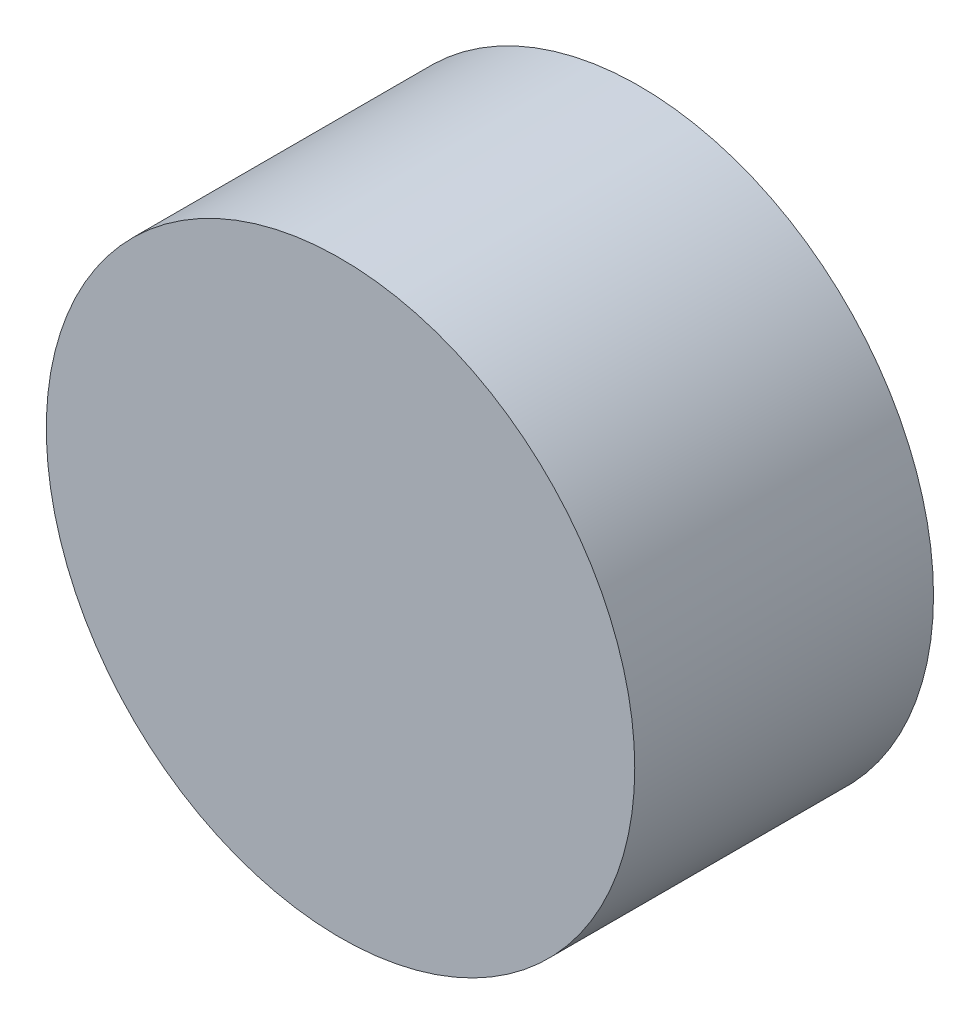
ISO-10303-21;
HEADER;
FILE_DESCRIPTION(('STEP AP214'),'2;1');
FILE_NAME('part.step','',(''),(''),'','','');
FILE_SCHEMA(('AUTOMOTIVE_DESIGN { 1 0 10303 214 1 1 1 1 }'));
ENDSEC;
DATA;
#1=APPLICATION_CONTEXT('core data for automotive mechanical design processes');
#2=APPLICATION_PROTOCOL_DEFINITION('international standard','automotive_design',2000,#1);
#3=PRODUCT_CONTEXT('',#1,'mechanical');
#4=PRODUCT('Part','Part','',(#3));
#5=PRODUCT_RELATED_PRODUCT_CATEGORY('part','',(#4));
#6=PRODUCT_DEFINITION_FORMATION('','',#4);
#7=PRODUCT_DEFINITION_CONTEXT('part definition',#1,'design');
#8=PRODUCT_DEFINITION('design','',#6,#7);
#9=PRODUCT_DEFINITION_SHAPE('','',#8);
#10=(LENGTH_UNIT() NAMED_UNIT(*) SI_UNIT(.MILLI.,.METRE.));
#11=(NAMED_UNIT(*) PLANE_ANGLE_UNIT() SI_UNIT($,.RADIAN.));
#12=(NAMED_UNIT(*) SI_UNIT($,.STERADIAN.) SOLID_ANGLE_UNIT());
#13=UNCERTAINTY_MEASURE_WITH_UNIT(LENGTH_MEASURE(1.E-05),#10,'distance_accuracy_value','');
#14=(GEOMETRIC_REPRESENTATION_CONTEXT(3) GLOBAL_UNCERTAINTY_ASSIGNED_CONTEXT((#13)) GLOBAL_UNIT_ASSIGNED_CONTEXT((#10,
#11,#12)) REPRESENTATION_CONTEXT('',''));
#15=CARTESIAN_POINT('',(0.,0.,0.));
#16=DIRECTION('',(0.,0.,1.));
#17=DIRECTION('',(1.,0.,0.));
#18=AXIS2_PLACEMENT_3D('',#15,#16,#17);
#19=CARTESIAN_POINT('',(0.,0.,33.));
#20=DIRECTION('',(0.,0.,-1.));
#21=DIRECTION('',(-1.,0.,0.));
#22=AXIS2_PLACEMENT_3D('',#19,#20,#21);
#23=CYLINDRICAL_SURFACE('',#22,32.5);
#24=CARTESIAN_POINT('',(0.,0.,33.));
#25=DIRECTION('',(0.,0.,1.));
#26=DIRECTION('',(1.,0.,0.));
#27=AXIS2_PLACEMENT_3D('',#24,#25,#26);
#28=CIRCLE('',#27,32.5);
#29=CARTESIAN_POINT('',(32.5,0.,33.));
#30=VERTEX_POINT('',#29);
#31=EDGE_CURVE('E10',#30,#30,#28,.T.);
#32=ORIENTED_EDGE('',*,*,#31,.F.);
#33=EDGE_LOOP('',(#32));
#34=FACE_BOUND('',#33,.T.);
#35=CARTESIAN_POINT('',(0.,0.,0.));
#36=DIRECTION('',(0.,0.,1.));
#37=DIRECTION('',(1.,0.,0.));
#38=AXIS2_PLACEMENT_3D('',#35,#36,#37);
#39=CIRCLE('',#38,32.5);
#40=CARTESIAN_POINT('',(32.5,0.,0.));
#41=VERTEX_POINT('',#40);
#42=EDGE_CURVE('E42',#41,#41,#39,.T.);
#43=ORIENTED_EDGE('',*,*,#42,.T.);
#44=EDGE_LOOP('',(#43));
#45=FACE_BOUND('',#44,.T.);
#46=ADVANCED_FACE('F39',(#34,#45),#23,.T.);
#47=CARTESIAN_POINT('',(0.,0.,33.));
#48=DIRECTION('',(0.,0.,1.));
#49=DIRECTION('',(1.,0.,0.));
#50=AXIS2_PLACEMENT_3D('',#47,#48,#49);
#51=PLANE('',#50);
#52=ORIENTED_EDGE('',*,*,#31,.T.);
#53=EDGE_LOOP('',(#52));
#54=FACE_BOUND('',#53,.T.);
#55=ADVANCED_FACE('F54',(#54),#51,.T.);
#56=CARTESIAN_POINT('',(0.,0.,0.));
#57=DIRECTION('',(0.,0.,1.));
#58=DIRECTION('',(1.,0.,0.));
#59=AXIS2_PLACEMENT_3D('',#56,#57,#58);
#60=PLANE('',#59);
#61=ORIENTED_EDGE('',*,*,#42,.F.);
#62=EDGE_LOOP('',(#61));
#63=FACE_BOUND('',#62,.T.);
#64=ADVANCED_FACE('F52',(#63),#60,.F.);
#65=CLOSED_SHELL('',(#46,#55,#64));
#66=MANIFOLD_SOLID_BREP('B2',#65);
#67=ADVANCED_BREP_SHAPE_REPRESENTATION('',(#18,#66),#14);
#68=SHAPE_DEFINITION_REPRESENTATION(#9,#67);
ENDSEC;
END-ISO-10303-21;
